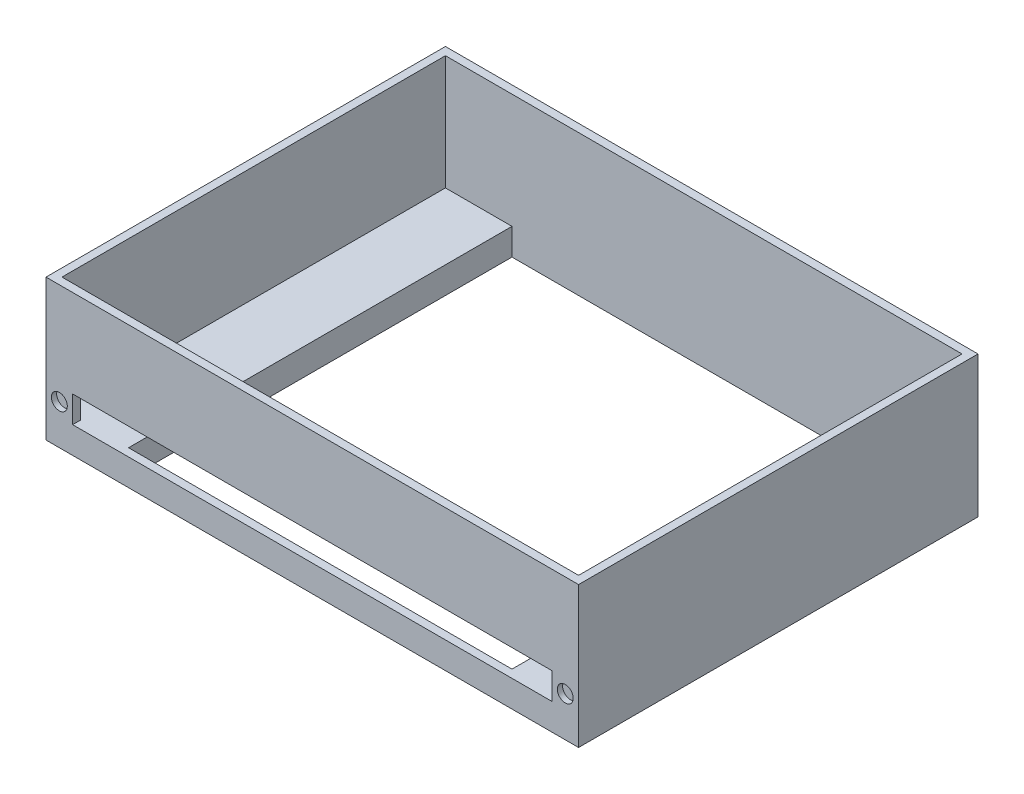
ISO-10303-21;
HEADER;
FILE_DESCRIPTION(('STEP AP214'),'2;1');
FILE_NAME('part.step','',(''),(''),'','','');
FILE_SCHEMA(('AUTOMOTIVE_DESIGN { 1 0 10303 214 1 1 1 1 }'));
ENDSEC;
DATA;
#1=APPLICATION_CONTEXT('core data for automotive mechanical design processes');
#2=APPLICATION_PROTOCOL_DEFINITION('international standard','automotive_design',2000,#1);
#3=PRODUCT_CONTEXT('',#1,'mechanical');
#4=PRODUCT('Part','Part','',(#3));
#5=PRODUCT_RELATED_PRODUCT_CATEGORY('part','',(#4));
#6=PRODUCT_DEFINITION_FORMATION('','',#4);
#7=PRODUCT_DEFINITION_CONTEXT('part definition',#1,'design');
#8=PRODUCT_DEFINITION('design','',#6,#7);
#9=PRODUCT_DEFINITION_SHAPE('','',#8);
#10=(LENGTH_UNIT() NAMED_UNIT(*) SI_UNIT(.MILLI.,.METRE.));
#11=(NAMED_UNIT(*) PLANE_ANGLE_UNIT() SI_UNIT($,.RADIAN.));
#12=(NAMED_UNIT(*) SI_UNIT($,.STERADIAN.) SOLID_ANGLE_UNIT());
#13=UNCERTAINTY_MEASURE_WITH_UNIT(LENGTH_MEASURE(1.E-05),#10,'distance_accuracy_value','');
#14=(GEOMETRIC_REPRESENTATION_CONTEXT(3) GLOBAL_UNCERTAINTY_ASSIGNED_CONTEXT((#13)) GLOBAL_UNIT_ASSIGNED_CONTEXT((#10,
#11,#12)) REPRESENTATION_CONTEXT('',''));
#15=CARTESIAN_POINT('',(0.,0.,0.));
#16=DIRECTION('',(0.,0.,1.));
#17=DIRECTION('',(1.,0.,0.));
#18=AXIS2_PLACEMENT_3D('',#15,#16,#17);
#19=CARTESIAN_POINT('',(-97.,53.,72.));
#20=DIRECTION('',(0.,0.,-1.));
#21=DIRECTION('',(-1.,0.,0.));
#22=AXIS2_PLACEMENT_3D('',#19,#20,#21);
#23=PLANE('',#22);
#24=DIRECTION('',(0.,1.,0.));
#25=VECTOR('',#24,1.);
#26=CARTESIAN_POINT('',(-90.,53.,72.));
#27=LINE('',#26,#25);
#28=CARTESIAN_POINT('',(-90.,10.,72.));
#29=VERTEX_POINT('',#28);
#30=CARTESIAN_POINT('',(-90.,20.,72.));
#31=VERTEX_POINT('',#30);
#32=EDGE_CURVE('E254',#29,#31,#27,.T.);
#33=ORIENTED_EDGE('',*,*,#32,.F.);
#34=DIRECTION('',(-1.,0.,0.));
#35=VECTOR('',#34,1.);
#36=CARTESIAN_POINT('',(-72.,10.,72.));
#37=LINE('',#36,#35);
#38=CARTESIAN_POINT('',(-97.,10.,72.));
#39=VERTEX_POINT('',#38);
#40=EDGE_CURVE('E202',#29,#39,#37,.T.);
#41=ORIENTED_EDGE('',*,*,#40,.T.);
#42=DIRECTION('',(0.,-1.,0.));
#43=VECTOR('',#42,1.);
#44=CARTESIAN_POINT('',(-97.,53.,72.));
#45=LINE('',#44,#43);
#46=CARTESIAN_POINT('',(-97.,53.,72.));
#47=VERTEX_POINT('',#46);
#48=EDGE_CURVE('E278',#47,#39,#45,.T.);
#49=ORIENTED_EDGE('',*,*,#48,.F.);
#50=DIRECTION('',(1.,0.,0.));
#51=VECTOR('',#50,1.);
#52=CARTESIAN_POINT('',(-97.,53.,72.));
#53=LINE('',#52,#51);
#54=CARTESIAN_POINT('',(97.,53.,72.));
#55=VERTEX_POINT('',#54);
#56=EDGE_CURVE('E265',#47,#55,#53,.T.);
#57=ORIENTED_EDGE('',*,*,#56,.T.);
#58=DIRECTION('',(0.,-1.,0.));
#59=VECTOR('',#58,1.);
#60=CARTESIAN_POINT('',(97.,53.,72.));
#61=LINE('',#60,#59);
#62=CARTESIAN_POINT('',(97.,10.,72.));
#63=VERTEX_POINT('',#62);
#64=EDGE_CURVE('E289',#55,#63,#61,.T.);
#65=ORIENTED_EDGE('',*,*,#64,.T.);
#66=DIRECTION('',(1.,0.,0.));
#67=VECTOR('',#66,1.);
#68=CARTESIAN_POINT('',(72.,10.,72.));
#69=LINE('',#68,#67);
#70=CARTESIAN_POINT('',(90.,10.,72.));
#71=VERTEX_POINT('',#70);
#72=EDGE_CURVE('E220',#71,#63,#69,.T.);
#73=ORIENTED_EDGE('',*,*,#72,.F.);
#74=DIRECTION('',(0.,-1.,0.));
#75=VECTOR('',#74,1.);
#76=CARTESIAN_POINT('',(90.,52.9999999999998,72.));
#77=LINE('',#76,#75);
#78=CARTESIAN_POINT('',(90.,20.,72.));
#79=VERTEX_POINT('',#78);
#80=EDGE_CURVE('E261',#79,#71,#77,.T.);
#81=ORIENTED_EDGE('',*,*,#80,.F.);
#82=DIRECTION('',(1.,0.,0.));
#83=VECTOR('',#82,1.);
#84=CARTESIAN_POINT('',(-97.,20.,72.));
#85=LINE('',#84,#83);
#86=EDGE_CURVE('E242',#31,#79,#85,.T.);
#87=ORIENTED_EDGE('',*,*,#86,.F.);
#88=EDGE_LOOP('',(#33,#41,#49,#57,#65,#73,#81,#87));
#89=FACE_BOUND('',#88,.T.);
#90=ADVANCED_FACE('F38',(#89),#23,.T.);
#91=DIRECTION('',(0.,1.,0.));
#92=VECTOR('',#91,1.);
#93=CARTESIAN_POINT('',(72.,10.,72.));
#94=LINE('',#93,#92);
#95=CARTESIAN_POINT('',(72.,0.,72.));
#96=VERTEX_POINT('',#95);
#97=CARTESIAN_POINT('',(72.0000000000001,9.99999999999998,72.));
#98=VERTEX_POINT('',#97);
#99=EDGE_CURVE('E162',#96,#98,#94,.T.);
#100=ORIENTED_EDGE('',*,*,#99,.F.);
#101=DIRECTION('',(1.,0.,0.));
#102=VECTOR('',#101,1.);
#103=CARTESIAN_POINT('',(-72.,0.,72.));
#104=LINE('',#103,#102);
#105=CARTESIAN_POINT('',(-72.,0.,72.));
#106=VERTEX_POINT('',#105);
#107=EDGE_CURVE('E177',#106,#96,#104,.T.);
#108=ORIENTED_EDGE('',*,*,#107,.F.);
#109=DIRECTION('',(0.,-1.,0.));
#110=VECTOR('',#109,1.);
#111=CARTESIAN_POINT('',(-72.,3.,72.));
#112=LINE('',#111,#110);
#113=CARTESIAN_POINT('',(-72.,10.,72.));
#114=VERTEX_POINT('',#113);
#115=EDGE_CURVE('E199',#114,#106,#112,.T.);
#116=ORIENTED_EDGE('',*,*,#115,.F.);
#117=DIRECTION('',(-1.,0.,0.));
#118=VECTOR('',#117,1.);
#119=CARTESIAN_POINT('',(-97.,10.,72.));
#120=LINE('',#119,#118);
#121=EDGE_CURVE('E258',#98,#114,#120,.T.);
#122=ORIENTED_EDGE('',*,*,#121,.F.);
#123=EDGE_LOOP('',(#100,#108,#116,#122));
#124=FACE_BOUND('',#123,.T.);
#125=ADVANCED_FACE('F356',(#124),#23,.T.);
#126=CARTESIAN_POINT('',(97.,53.,-72.));
#127=DIRECTION('',(0.,0.,1.));
#128=DIRECTION('',(1.,0.,0.));
#129=AXIS2_PLACEMENT_3D('',#126,#127,#128);
#130=PLANE('',#129);
#131=DIRECTION('',(0.,-1.,0.));
#132=VECTOR('',#131,1.);
#133=CARTESIAN_POINT('',(-97.,53.,-72.));
#134=LINE('',#133,#132);
#135=CARTESIAN_POINT('',(-97.,53.,-72.));
#136=VERTEX_POINT('',#135);
#137=CARTESIAN_POINT('',(-97.,10.,-72.));
#138=VERTEX_POINT('',#137);
#139=EDGE_CURVE('E282',#136,#138,#134,.T.);
#140=ORIENTED_EDGE('',*,*,#139,.T.);
#141=DIRECTION('',(-1.,0.,0.));
#142=VECTOR('',#141,1.);
#143=CARTESIAN_POINT('',(-72.,10.,-72.));
#144=LINE('',#143,#142);
#145=CARTESIAN_POINT('',(-72.,10.,-72.));
#146=VERTEX_POINT('',#145);
#147=EDGE_CURVE('E208',#146,#138,#144,.T.);
#148=ORIENTED_EDGE('',*,*,#147,.F.);
#149=DIRECTION('',(0.,1.,0.));
#150=VECTOR('',#149,1.);
#151=CARTESIAN_POINT('',(-72.,3.,-72.));
#152=LINE('',#151,#150);
#153=CARTESIAN_POINT('',(-72.,0.,-72.));
#154=VERTEX_POINT('',#153);
#155=EDGE_CURVE('E54',#154,#146,#152,.T.);
#156=ORIENTED_EDGE('',*,*,#155,.F.);
#157=DIRECTION('',(-1.,0.,0.));
#158=VECTOR('',#157,1.);
#159=CARTESIAN_POINT('',(72.,0.,-72.));
#160=LINE('',#159,#158);
#161=CARTESIAN_POINT('',(72.,0.,-72.));
#162=VERTEX_POINT('',#161);
#163=EDGE_CURVE('E166',#162,#154,#160,.T.);
#164=ORIENTED_EDGE('',*,*,#163,.F.);
#165=DIRECTION('',(0.,-1.,0.));
#166=VECTOR('',#165,1.);
#167=CARTESIAN_POINT('',(72.,10.,-72.));
#168=LINE('',#167,#166);
#169=CARTESIAN_POINT('',(72.,10.,-72.));
#170=VERTEX_POINT('',#169);
#171=EDGE_CURVE('E155',#170,#162,#168,.T.);
#172=ORIENTED_EDGE('',*,*,#171,.F.);
#173=DIRECTION('',(1.,0.,0.));
#174=VECTOR('',#173,1.);
#175=CARTESIAN_POINT('',(72.,10.,-72.));
#176=LINE('',#175,#174);
#177=CARTESIAN_POINT('',(97.,10.,-72.));
#178=VERTEX_POINT('',#177);
#179=EDGE_CURVE('E215',#170,#178,#176,.T.);
#180=ORIENTED_EDGE('',*,*,#179,.T.);
#181=DIRECTION('',(0.,-1.,0.));
#182=VECTOR('',#181,1.);
#183=CARTESIAN_POINT('',(97.,53.,-72.));
#184=LINE('',#183,#182);
#185=CARTESIAN_POINT('',(97.,53.,-72.));
#186=VERTEX_POINT('',#185);
#187=EDGE_CURVE('E285',#186,#178,#184,.T.);
#188=ORIENTED_EDGE('',*,*,#187,.F.);
#189=DIRECTION('',(-1.,0.,0.));
#190=VECTOR('',#189,1.);
#191=CARTESIAN_POINT('',(97.,53.,-72.));
#192=LINE('',#191,#190);
#193=EDGE_CURVE('E271',#186,#136,#192,.T.);
#194=ORIENTED_EDGE('',*,*,#193,.T.);
#195=EDGE_LOOP('',(#140,#148,#156,#164,#172,#180,#188,#194));
#196=FACE_BOUND('',#195,.T.);
#197=ADVANCED_FACE('F168',(#196),#130,.T.);
#198=CARTESIAN_POINT('',(-97.,53.,-72.));
#199=DIRECTION('',(1.,0.,0.));
#200=DIRECTION('',(0.,0.,-1.));
#201=AXIS2_PLACEMENT_3D('',#198,#199,#200);
#202=PLANE('',#201);
#203=ORIENTED_EDGE('',*,*,#48,.T.);
#204=DIRECTION('',(0.,0.,1.));
#205=VECTOR('',#204,1.);
#206=CARTESIAN_POINT('',(-97.,10.,72.));
#207=LINE('',#206,#205);
#208=EDGE_CURVE('E193',#138,#39,#207,.T.);
#209=ORIENTED_EDGE('',*,*,#208,.F.);
#210=ORIENTED_EDGE('',*,*,#139,.F.);
#211=DIRECTION('',(0.,0.,1.));
#212=VECTOR('',#211,1.);
#213=CARTESIAN_POINT('',(-97.,53.,-72.));
#214=LINE('',#213,#212);
#215=EDGE_CURVE('E275',#136,#47,#214,.T.);
#216=ORIENTED_EDGE('',*,*,#215,.T.);
#217=EDGE_LOOP('',(#203,#209,#210,#216));
#218=FACE_BOUND('',#217,.T.);
#219=ADVANCED_FACE('F406',(#218),#202,.T.);
#220=CARTESIAN_POINT('',(97.,53.,72.));
#221=DIRECTION('',(-1.,0.,0.));
#222=DIRECTION('',(0.,0.,1.));
#223=AXIS2_PLACEMENT_3D('',#220,#221,#222);
#224=PLANE('',#223);
#225=ORIENTED_EDGE('',*,*,#187,.T.);
#226=DIRECTION('',(0.,0.,-1.));
#227=VECTOR('',#226,1.);
#228=CARTESIAN_POINT('',(97.,10.,72.));
#229=LINE('',#228,#227);
#230=EDGE_CURVE('E163',#63,#178,#229,.T.);
#231=ORIENTED_EDGE('',*,*,#230,.F.);
#232=ORIENTED_EDGE('',*,*,#64,.F.);
#233=DIRECTION('',(0.,0.,-1.));
#234=VECTOR('',#233,1.);
#235=CARTESIAN_POINT('',(97.,53.,72.));
#236=LINE('',#235,#234);
#237=EDGE_CURVE('E268',#55,#186,#236,.T.);
#238=ORIENTED_EDGE('',*,*,#237,.T.);
#239=EDGE_LOOP('',(#225,#231,#232,#238));
#240=FACE_BOUND('',#239,.T.);
#241=ADVANCED_FACE('F354',(#240),#224,.T.);
#242=CARTESIAN_POINT('',(100.,3.,-75.));
#243=DIRECTION('',(-1.,0.,0.));
#244=DIRECTION('',(0.,0.,1.));
#245=AXIS2_PLACEMENT_3D('',#242,#243,#244);
#246=PLANE('',#245);
#247=DIRECTION('',(0.,0.,-1.));
#248=VECTOR('',#247,1.);
#249=CARTESIAN_POINT('',(100.,0.,-75.));
#250=LINE('',#249,#248);
#251=CARTESIAN_POINT('',(100.,0.,75.));
#252=VERTEX_POINT('',#251);
#253=CARTESIAN_POINT('',(100.,0.,-75.));
#254=VERTEX_POINT('',#253);
#255=EDGE_CURVE('E309',#252,#254,#250,.T.);
#256=ORIENTED_EDGE('',*,*,#255,.T.);
#257=DIRECTION('',(0.,-1.,0.));
#258=VECTOR('',#257,1.);
#259=CARTESIAN_POINT('',(100.,3.,-75.));
#260=LINE('',#259,#258);
#261=CARTESIAN_POINT('',(100.,53.,-75.));
#262=VERTEX_POINT('',#261);
#263=EDGE_CURVE('E11',#262,#254,#260,.T.);
#264=ORIENTED_EDGE('',*,*,#263,.F.);
#265=DIRECTION('',(0.,0.,-1.));
#266=VECTOR('',#265,1.);
#267=CARTESIAN_POINT('',(100.,53.,75.));
#268=LINE('',#267,#266);
#269=CARTESIAN_POINT('',(100.,53.,75.));
#270=VERTEX_POINT('',#269);
#271=EDGE_CURVE('E297',#270,#262,#268,.T.);
#272=ORIENTED_EDGE('',*,*,#271,.F.);
#273=DIRECTION('',(0.,-1.,0.));
#274=VECTOR('',#273,1.);
#275=CARTESIAN_POINT('',(100.,3.,75.));
#276=LINE('',#275,#274);
#277=EDGE_CURVE('E322',#270,#252,#276,.T.);
#278=ORIENTED_EDGE('',*,*,#277,.T.);
#279=EDGE_LOOP('',(#256,#264,#272,#278));
#280=FACE_BOUND('',#279,.T.);
#281=ADVANCED_FACE('F40',(#280),#246,.F.);
#282=CARTESIAN_POINT('',(-100.,3.,-75.));
#283=DIRECTION('',(0.,0.,1.));
#284=DIRECTION('',(1.,0.,0.));
#285=AXIS2_PLACEMENT_3D('',#282,#283,#284);
#286=PLANE('',#285);
#287=DIRECTION('',(-1.,0.,0.));
#288=VECTOR('',#287,1.);
#289=CARTESIAN_POINT('',(-100.,0.,-75.));
#290=LINE('',#289,#288);
#291=CARTESIAN_POINT('',(-100.,0.,-75.));
#292=VERTEX_POINT('',#291);
#293=EDGE_CURVE('E313',#254,#292,#290,.T.);
#294=ORIENTED_EDGE('',*,*,#293,.T.);
#295=DIRECTION('',(0.,-1.,0.));
#296=VECTOR('',#295,1.);
#297=CARTESIAN_POINT('',(-100.,3.,-75.));
#298=LINE('',#297,#296);
#299=CARTESIAN_POINT('',(-100.,53.,-75.));
#300=VERTEX_POINT('',#299);
#301=EDGE_CURVE('E47',#300,#292,#298,.T.);
#302=ORIENTED_EDGE('',*,*,#301,.F.);
#303=DIRECTION('',(-1.,0.,0.));
#304=VECTOR('',#303,1.);
#305=CARTESIAN_POINT('',(100.,53.,-75.));
#306=LINE('',#305,#304);
#307=EDGE_CURVE('E301',#262,#300,#306,.T.);
#308=ORIENTED_EDGE('',*,*,#307,.F.);
#309=ORIENTED_EDGE('',*,*,#263,.T.);
#310=EDGE_LOOP('',(#294,#302,#308,#309));
#311=FACE_BOUND('',#310,.T.);
#312=ADVANCED_FACE('F347',(#311),#286,.F.);
#313=CARTESIAN_POINT('',(-100.,3.,-75.));
#314=DIRECTION('',(1.,0.,0.));
#315=DIRECTION('',(0.,0.,-1.));
#316=AXIS2_PLACEMENT_3D('',#313,#314,#315);
#317=PLANE('',#316);
#318=DIRECTION('',(0.,0.,1.));
#319=VECTOR('',#318,1.);
#320=CARTESIAN_POINT('',(-100.,0.,-75.));
#321=LINE('',#320,#319);
#322=CARTESIAN_POINT('',(-100.,0.,75.));
#323=VERTEX_POINT('',#322);
#324=EDGE_CURVE('E316',#292,#323,#321,.T.);
#325=ORIENTED_EDGE('',*,*,#324,.T.);
#326=DIRECTION('',(0.,-1.,0.));
#327=VECTOR('',#326,1.);
#328=CARTESIAN_POINT('',(-100.,3.,75.));
#329=LINE('',#328,#327);
#330=CARTESIAN_POINT('',(-100.,53.,75.));
#331=VERTEX_POINT('',#330);
#332=EDGE_CURVE('E326',#331,#323,#329,.T.);
#333=ORIENTED_EDGE('',*,*,#332,.F.);
#334=DIRECTION('',(0.,0.,1.));
#335=VECTOR('',#334,1.);
#336=CARTESIAN_POINT('',(-100.,53.,-75.));
#337=LINE('',#336,#335);
#338=EDGE_CURVE('E305',#300,#331,#337,.T.);
#339=ORIENTED_EDGE('',*,*,#338,.F.);
#340=ORIENTED_EDGE('',*,*,#301,.T.);
#341=EDGE_LOOP('',(#325,#333,#339,#340));
#342=FACE_BOUND('',#341,.T.);
#343=ADVANCED_FACE('F334',(#342),#317,.F.);
#344=CARTESIAN_POINT('',(-100.,3.,75.));
#345=DIRECTION('',(0.,0.,-1.));
#346=DIRECTION('',(-1.,0.,0.));
#347=AXIS2_PLACEMENT_3D('',#344,#345,#346);
#348=PLANE('',#347);
#349=CARTESIAN_POINT('',(-95.,15.,75.));
#350=DIRECTION('',(0.,0.,1.));
#351=DIRECTION('',(1.,0.,0.));
#352=AXIS2_PLACEMENT_3D('',#349,#350,#351);
#353=CIRCLE('',#352,3.00000000000001);
#354=CARTESIAN_POINT('',(-92.,15.,75.));
#355=VERTEX_POINT('',#354);
#356=EDGE_CURVE('E183',#355,#355,#353,.T.);
#357=ORIENTED_EDGE('',*,*,#356,.F.);
#358=EDGE_LOOP('',(#357));
#359=FACE_BOUND('',#358,.T.);
#360=CARTESIAN_POINT('',(95.,15.,75.));
#361=DIRECTION('',(0.,0.,1.));
#362=DIRECTION('',(1.,0.,0.));
#363=AXIS2_PLACEMENT_3D('',#360,#361,#362);
#364=CIRCLE('',#363,3.00000000000001);
#365=CARTESIAN_POINT('',(98.,15.,75.));
#366=VERTEX_POINT('',#365);
#367=EDGE_CURVE('E186',#366,#366,#364,.T.);
#368=ORIENTED_EDGE('',*,*,#367,.F.);
#369=EDGE_LOOP('',(#368));
#370=FACE_BOUND('',#369,.T.);
#371=DIRECTION('',(-1.,0.,0.));
#372=VECTOR('',#371,1.);
#373=CARTESIAN_POINT('',(-90.,20.,75.));
#374=LINE('',#373,#372);
#375=CARTESIAN_POINT('',(90.,20.,75.));
#376=VERTEX_POINT('',#375);
#377=CARTESIAN_POINT('',(-90.,20.,75.));
#378=VERTEX_POINT('',#377);
#379=EDGE_CURVE('E226',#376,#378,#374,.T.);
#380=ORIENTED_EDGE('',*,*,#379,.F.);
#381=DIRECTION('',(0.,1.,0.));
#382=VECTOR('',#381,1.);
#383=CARTESIAN_POINT('',(90.,20.,75.));
#384=LINE('',#383,#382);
#385=CARTESIAN_POINT('',(90.,9.99999999999998,75.));
#386=VERTEX_POINT('',#385);
#387=EDGE_CURVE('E223',#386,#376,#384,.T.);
#388=ORIENTED_EDGE('',*,*,#387,.F.);
#389=DIRECTION('',(1.,0.,0.));
#390=VECTOR('',#389,1.);
#391=CARTESIAN_POINT('',(-90.,10.,75.));
#392=LINE('',#391,#390);
#393=CARTESIAN_POINT('',(-90.,10.,75.));
#394=VERTEX_POINT('',#393);
#395=EDGE_CURVE('E234',#394,#386,#392,.T.);
#396=ORIENTED_EDGE('',*,*,#395,.F.);
#397=DIRECTION('',(0.,-1.,0.));
#398=VECTOR('',#397,1.);
#399=CARTESIAN_POINT('',(-90.,20.,75.));
#400=LINE('',#399,#398);
#401=EDGE_CURVE('E230',#378,#394,#400,.T.);
#402=ORIENTED_EDGE('',*,*,#401,.F.);
#403=EDGE_LOOP('',(#380,#388,#396,#402));
#404=FACE_BOUND('',#403,.T.);
#405=DIRECTION('',(1.,0.,0.));
#406=VECTOR('',#405,1.);
#407=CARTESIAN_POINT('',(-100.,0.,75.));
#408=LINE('',#407,#406);
#409=EDGE_CURVE('E319',#323,#252,#408,.T.);
#410=ORIENTED_EDGE('',*,*,#409,.T.);
#411=ORIENTED_EDGE('',*,*,#277,.F.);
#412=DIRECTION('',(1.,0.,0.));
#413=VECTOR('',#412,1.);
#414=CARTESIAN_POINT('',(-100.,53.,75.));
#415=LINE('',#414,#413);
#416=EDGE_CURVE('E293',#331,#270,#415,.T.);
#417=ORIENTED_EDGE('',*,*,#416,.F.);
#418=ORIENTED_EDGE('',*,*,#332,.T.);
#419=EDGE_LOOP('',(#410,#411,#417,#418));
#420=FACE_BOUND('',#419,.T.);
#421=ADVANCED_FACE('F340',(#359,#370,#404,#420),#348,.F.);
#422=CARTESIAN_POINT('',(0.,0.,0.));
#423=DIRECTION('',(0.,1.,0.));
#424=DIRECTION('',(0.,0.,1.));
#425=AXIS2_PLACEMENT_3D('',#422,#423,#424);
#426=PLANE('',#425);
#427=CARTESIAN_POINT('',(-95.,0.,-70.));
#428=DIRECTION('',(0.,-1.,0.));
#429=DIRECTION('',(0.,0.,-1.));
#430=AXIS2_PLACEMENT_3D('',#427,#428,#429);
#431=CIRCLE('',#430,1.5);
#432=CARTESIAN_POINT('',(-95.,0.,-71.5));
#433=VERTEX_POINT('',#432);
#434=EDGE_CURVE('E663',#433,#433,#431,.T.);
#435=ORIENTED_EDGE('',*,*,#434,.F.);
#436=EDGE_LOOP('',(#435));
#437=FACE_BOUND('',#436,.T.);
#438=CARTESIAN_POINT('',(95.,0.,-70.));
#439=DIRECTION('',(0.,-1.,0.));
#440=DIRECTION('',(0.,0.,-1.));
#441=AXIS2_PLACEMENT_3D('',#438,#439,#440);
#442=CIRCLE('',#441,1.5);
#443=CARTESIAN_POINT('',(95.,0.,-71.5));
#444=VERTEX_POINT('',#443);
#445=EDGE_CURVE('E662',#444,#444,#442,.T.);
#446=ORIENTED_EDGE('',*,*,#445,.F.);
#447=EDGE_LOOP('',(#446));
#448=FACE_BOUND('',#447,.T.);
#449=CARTESIAN_POINT('',(95.,0.,70.));
#450=DIRECTION('',(0.,-1.,0.));
#451=DIRECTION('',(0.,0.,-1.));
#452=AXIS2_PLACEMENT_3D('',#449,#450,#451);
#453=CIRCLE('',#452,1.5);
#454=CARTESIAN_POINT('',(95.,0.,68.5));
#455=VERTEX_POINT('',#454);
#456=EDGE_CURVE('E693',#455,#455,#453,.T.);
#457=ORIENTED_EDGE('',*,*,#456,.F.);
#458=EDGE_LOOP('',(#457));
#459=FACE_BOUND('',#458,.T.);
#460=CARTESIAN_POINT('',(-95.,0.,70.));
#461=DIRECTION('',(0.,-1.,0.));
#462=DIRECTION('',(0.,0.,-1.));
#463=AXIS2_PLACEMENT_3D('',#460,#461,#462);
#464=CIRCLE('',#463,1.5);
#465=CARTESIAN_POINT('',(-95.,0.,68.5));
#466=VERTEX_POINT('',#465);
#467=EDGE_CURVE('E678',#466,#466,#464,.T.);
#468=ORIENTED_EDGE('',*,*,#467,.F.);
#469=EDGE_LOOP('',(#468));
#470=FACE_BOUND('',#469,.T.);
#471=ORIENTED_EDGE('',*,*,#107,.T.);
#472=DIRECTION('',(0.,0.,-1.));
#473=VECTOR('',#472,1.);
#474=CARTESIAN_POINT('',(72.,0.,72.));
#475=LINE('',#474,#473);
#476=EDGE_CURVE('E158',#96,#162,#475,.T.);
#477=ORIENTED_EDGE('',*,*,#476,.T.);
#478=ORIENTED_EDGE('',*,*,#163,.T.);
#479=DIRECTION('',(0.,0.,1.));
#480=VECTOR('',#479,1.);
#481=CARTESIAN_POINT('',(-72.,0.,-72.));
#482=LINE('',#481,#480);
#483=EDGE_CURVE('E172',#154,#106,#482,.T.);
#484=ORIENTED_EDGE('',*,*,#483,.T.);
#485=EDGE_LOOP('',(#471,#477,#478,#484));
#486=FACE_BOUND('',#485,.T.);
#487=ORIENTED_EDGE('',*,*,#255,.F.);
#488=ORIENTED_EDGE('',*,*,#409,.F.);
#489=ORIENTED_EDGE('',*,*,#324,.F.);
#490=ORIENTED_EDGE('',*,*,#293,.F.);
#491=EDGE_LOOP('',(#487,#488,#489,#490));
#492=FACE_BOUND('',#491,.T.);
#493=ADVANCED_FACE('F174',(#437,#448,#459,#470,#486,#492),#426,.F.);
#494=CARTESIAN_POINT('',(0.,53.,0.));
#495=DIRECTION('',(0.,1.,0.));
#496=DIRECTION('',(0.,0.,1.));
#497=AXIS2_PLACEMENT_3D('',#494,#495,#496);
#498=PLANE('',#497);
#499=ORIENTED_EDGE('',*,*,#416,.T.);
#500=ORIENTED_EDGE('',*,*,#271,.T.);
#501=ORIENTED_EDGE('',*,*,#307,.T.);
#502=ORIENTED_EDGE('',*,*,#338,.T.);
#503=EDGE_LOOP('',(#499,#500,#501,#502));
#504=FACE_BOUND('',#503,.T.);
#505=ORIENTED_EDGE('',*,*,#237,.F.);
#506=ORIENTED_EDGE('',*,*,#56,.F.);
#507=ORIENTED_EDGE('',*,*,#215,.F.);
#508=ORIENTED_EDGE('',*,*,#193,.F.);
#509=EDGE_LOOP('',(#505,#506,#507,#508));
#510=FACE_BOUND('',#509,.T.);
#511=ADVANCED_FACE('F345',(#504,#510),#498,.T.);
#512=CARTESIAN_POINT('',(90.,20.,-252.277563773199));
#513=DIRECTION('',(1.,0.,0.));
#514=DIRECTION('',(0.,1.,0.));
#515=AXIS2_PLACEMENT_3D('',#512,#513,#514);
#516=PLANE('',#515);
#517=ORIENTED_EDGE('',*,*,#80,.T.);
#518=DIRECTION('',(0.,0.,1.));
#519=VECTOR('',#518,1.);
#520=CARTESIAN_POINT('',(90.,9.99999999999998,-252.277563773199));
#521=LINE('',#520,#519);
#522=EDGE_CURVE('E239',#71,#386,#521,.T.);
#523=ORIENTED_EDGE('',*,*,#522,.T.);
#524=ORIENTED_EDGE('',*,*,#387,.T.);
#525=DIRECTION('',(0.,0.,1.));
#526=VECTOR('',#525,1.);
#527=CARTESIAN_POINT('',(90.,20.,-252.277563773199));
#528=LINE('',#527,#526);
#529=EDGE_CURVE('E238',#79,#376,#528,.T.);
#530=ORIENTED_EDGE('',*,*,#529,.F.);
#531=EDGE_LOOP('',(#517,#523,#524,#530));
#532=FACE_BOUND('',#531,.T.);
#533=ADVANCED_FACE('F369',(#532),#516,.F.);
#534=CARTESIAN_POINT('',(-90.,10.,-252.277563773199));
#535=DIRECTION('',(0.,-1.,0.));
#536=DIRECTION('',(1.,0.,0.));
#537=AXIS2_PLACEMENT_3D('',#534,#535,#536);
#538=PLANE('',#537);
#539=ORIENTED_EDGE('',*,*,#522,.F.);
#540=ORIENTED_EDGE('',*,*,#72,.T.);
#541=ORIENTED_EDGE('',*,*,#230,.T.);
#542=ORIENTED_EDGE('',*,*,#179,.F.);
#543=DIRECTION('',(0.,0.,-1.));
#544=VECTOR('',#543,1.);
#545=CARTESIAN_POINT('',(72.,10.,72.));
#546=LINE('',#545,#544);
#547=EDGE_CURVE('E62',#98,#170,#546,.T.);
#548=ORIENTED_EDGE('',*,*,#547,.F.);
#549=ORIENTED_EDGE('',*,*,#121,.T.);
#550=DIRECTION('',(0.,0.,1.));
#551=VECTOR('',#550,1.);
#552=CARTESIAN_POINT('',(-72.,10.,72.));
#553=LINE('',#552,#551);
#554=EDGE_CURVE('E196',#146,#114,#553,.T.);
#555=ORIENTED_EDGE('',*,*,#554,.F.);
#556=ORIENTED_EDGE('',*,*,#147,.T.);
#557=ORIENTED_EDGE('',*,*,#208,.T.);
#558=ORIENTED_EDGE('',*,*,#40,.F.);
#559=DIRECTION('',(0.,0.,1.));
#560=VECTOR('',#559,1.);
#561=CARTESIAN_POINT('',(-90.,10.,-252.277563773199));
#562=LINE('',#561,#560);
#563=EDGE_CURVE('E243',#29,#394,#562,.T.);
#564=ORIENTED_EDGE('',*,*,#563,.T.);
#565=ORIENTED_EDGE('',*,*,#395,.T.);
#566=EDGE_LOOP('',(#539,#540,#541,#542,#548,#549,#555,#556,#557,#558,#564,#565));
#567=FACE_BOUND('',#566,.T.);
#568=ADVANCED_FACE('F397',(#567),#538,.F.);
#569=CARTESIAN_POINT('',(-90.,20.,-252.277563773199));
#570=DIRECTION('',(-1.,0.,0.));
#571=DIRECTION('',(0.,0.,1.));
#572=AXIS2_PLACEMENT_3D('',#569,#570,#571);
#573=PLANE('',#572);
#574=ORIENTED_EDGE('',*,*,#32,.T.);
#575=DIRECTION('',(0.,0.,1.));
#576=VECTOR('',#575,1.);
#577=CARTESIAN_POINT('',(-90.,20.,-252.277563773199));
#578=LINE('',#577,#576);
#579=EDGE_CURVE('E246',#31,#378,#578,.T.);
#580=ORIENTED_EDGE('',*,*,#579,.T.);
#581=ORIENTED_EDGE('',*,*,#401,.T.);
#582=ORIENTED_EDGE('',*,*,#563,.F.);
#583=EDGE_LOOP('',(#574,#580,#581,#582));
#584=FACE_BOUND('',#583,.T.);
#585=ADVANCED_FACE('F410',(#584),#573,.F.);
#586=CARTESIAN_POINT('',(-90.,20.,-252.277563773199));
#587=DIRECTION('',(0.,1.,0.));
#588=DIRECTION('',(-1.,0.,0.));
#589=AXIS2_PLACEMENT_3D('',#586,#587,#588);
#590=PLANE('',#589);
#591=ORIENTED_EDGE('',*,*,#86,.T.);
#592=ORIENTED_EDGE('',*,*,#529,.T.);
#593=ORIENTED_EDGE('',*,*,#379,.T.);
#594=ORIENTED_EDGE('',*,*,#579,.F.);
#595=EDGE_LOOP('',(#591,#592,#593,#594));
#596=FACE_BOUND('',#595,.T.);
#597=ADVANCED_FACE('F389',(#596),#590,.F.);
#598=CARTESIAN_POINT('',(72.,0.,0.));
#599=DIRECTION('',(1.,0.,0.));
#600=DIRECTION('',(0.,0.,-1.));
#601=AXIS2_PLACEMENT_3D('',#598,#599,#600);
#602=PLANE('',#601);
#603=ORIENTED_EDGE('',*,*,#171,.T.);
#604=ORIENTED_EDGE('',*,*,#476,.F.);
#605=ORIENTED_EDGE('',*,*,#99,.T.);
#606=ORIENTED_EDGE('',*,*,#547,.T.);
#607=EDGE_LOOP('',(#603,#604,#605,#606));
#608=FACE_BOUND('',#607,.T.);
#609=ADVANCED_FACE('F156',(#608),#602,.F.);
#610=CARTESIAN_POINT('',(-72.,0.,0.));
#611=DIRECTION('',(-1.,0.,0.));
#612=DIRECTION('',(0.,0.,1.));
#613=AXIS2_PLACEMENT_3D('',#610,#611,#612);
#614=PLANE('',#613);
#615=ORIENTED_EDGE('',*,*,#155,.T.);
#616=ORIENTED_EDGE('',*,*,#554,.T.);
#617=ORIENTED_EDGE('',*,*,#115,.T.);
#618=ORIENTED_EDGE('',*,*,#483,.F.);
#619=EDGE_LOOP('',(#615,#616,#617,#618));
#620=FACE_BOUND('',#619,.T.);
#621=ADVANCED_FACE('F481',(#620),#614,.F.);
#622=CARTESIAN_POINT('',(95.,15.,73.));
#623=DIRECTION('',(0.,0.,1.));
#624=DIRECTION('',(1.,0.,0.));
#625=AXIS2_PLACEMENT_3D('',#622,#623,#624);
#626=CYLINDRICAL_SURFACE('',#625,3.00000000000001);
#627=CARTESIAN_POINT('',(95.,15.,73.));
#628=DIRECTION('',(0.,0.,1.));
#629=DIRECTION('',(1.,0.,0.));
#630=AXIS2_PLACEMENT_3D('',#627,#628,#629);
#631=CIRCLE('',#630,3.00000000000001);
#632=CARTESIAN_POINT('',(98.,15.,73.));
#633=VERTEX_POINT('',#632);
#634=EDGE_CURVE('E684',#633,#633,#631,.T.);
#635=ORIENTED_EDGE('',*,*,#634,.F.);
#636=EDGE_LOOP('',(#635));
#637=FACE_BOUND('',#636,.T.);
#638=ORIENTED_EDGE('',*,*,#367,.T.);
#639=EDGE_LOOP('',(#638));
#640=FACE_BOUND('',#639,.T.);
#641=ADVANCED_FACE('F487',(#637,#640),#626,.F.);
#642=CARTESIAN_POINT('',(95.,15.,73.));
#643=DIRECTION('',(0.,0.,1.));
#644=DIRECTION('',(1.,0.,0.));
#645=AXIS2_PLACEMENT_3D('',#642,#643,#644);
#646=PLANE('',#645);
#647=ORIENTED_EDGE('',*,*,#634,.T.);
#648=EDGE_LOOP('',(#647));
#649=FACE_BOUND('',#648,.T.);
#650=ADVANCED_FACE('F495',(#649),#646,.T.);
#651=CARTESIAN_POINT('',(-95.,15.,73.));
#652=DIRECTION('',(0.,0.,1.));
#653=DIRECTION('',(1.,0.,0.));
#654=AXIS2_PLACEMENT_3D('',#651,#652,#653);
#655=CYLINDRICAL_SURFACE('',#654,3.00000000000001);
#656=CARTESIAN_POINT('',(-95.,15.,73.));
#657=DIRECTION('',(0.,0.,1.));
#658=DIRECTION('',(1.,0.,0.));
#659=AXIS2_PLACEMENT_3D('',#656,#657,#658);
#660=CIRCLE('',#659,3.00000000000001);
#661=CARTESIAN_POINT('',(-92.,15.,73.));
#662=VERTEX_POINT('',#661);
#663=EDGE_CURVE('E179',#662,#662,#660,.T.);
#664=ORIENTED_EDGE('',*,*,#663,.F.);
#665=EDGE_LOOP('',(#664));
#666=FACE_BOUND('',#665,.T.);
#667=ORIENTED_EDGE('',*,*,#356,.T.);
#668=EDGE_LOOP('',(#667));
#669=FACE_BOUND('',#668,.T.);
#670=ADVANCED_FACE('F503',(#666,#669),#655,.F.);
#671=CARTESIAN_POINT('',(-95.,15.,73.));
#672=DIRECTION('',(0.,0.,1.));
#673=DIRECTION('',(1.,0.,0.));
#674=AXIS2_PLACEMENT_3D('',#671,#672,#673);
#675=PLANE('',#674);
#676=ORIENTED_EDGE('',*,*,#663,.T.);
#677=EDGE_LOOP('',(#676));
#678=FACE_BOUND('',#677,.T.);
#679=ADVANCED_FACE('F511',(#678),#675,.T.);
#680=CARTESIAN_POINT('',(-95.,8.,70.));
#681=DIRECTION('',(0.,-1.,0.));
#682=DIRECTION('',(0.,0.,-1.));
#683=AXIS2_PLACEMENT_3D('',#680,#681,#682);
#684=CYLINDRICAL_SURFACE('',#683,1.5);
#685=CARTESIAN_POINT('',(-95.,8.,70.));
#686=DIRECTION('',(0.,-1.,0.));
#687=DIRECTION('',(0.,0.,-1.));
#688=AXIS2_PLACEMENT_3D('',#685,#686,#687);
#689=CIRCLE('',#688,1.5);
#690=CARTESIAN_POINT('',(-95.,8.,68.5));
#691=VERTEX_POINT('',#690);
#692=EDGE_CURVE('E674',#691,#691,#689,.T.);
#693=ORIENTED_EDGE('',*,*,#692,.F.);
#694=EDGE_LOOP('',(#693));
#695=FACE_BOUND('',#694,.T.);
#696=ORIENTED_EDGE('',*,*,#467,.T.);
#697=EDGE_LOOP('',(#696));
#698=FACE_BOUND('',#697,.T.);
#699=ADVANCED_FACE('F519',(#695,#698),#684,.F.);
#700=CARTESIAN_POINT('',(-95.,8.,70.));
#701=DIRECTION('',(0.,-1.,0.));
#702=DIRECTION('',(0.,0.,-1.));
#703=AXIS2_PLACEMENT_3D('',#700,#701,#702);
#704=PLANE('',#703);
#705=ORIENTED_EDGE('',*,*,#692,.T.);
#706=EDGE_LOOP('',(#705));
#707=FACE_BOUND('',#706,.T.);
#708=ADVANCED_FACE('F527',(#707),#704,.T.);
#709=CARTESIAN_POINT('',(95.,8.,70.));
#710=DIRECTION('',(0.,-1.,0.));
#711=DIRECTION('',(0.,0.,-1.));
#712=AXIS2_PLACEMENT_3D('',#709,#710,#711);
#713=CYLINDRICAL_SURFACE('',#712,1.5);
#714=CARTESIAN_POINT('',(95.,8.,70.));
#715=DIRECTION('',(0.,-1.,0.));
#716=DIRECTION('',(0.,0.,-1.));
#717=AXIS2_PLACEMENT_3D('',#714,#715,#716);
#718=CIRCLE('',#717,1.5);
#719=CARTESIAN_POINT('',(95.,8.,68.5));
#720=VERTEX_POINT('',#719);
#721=EDGE_CURVE('E681',#720,#720,#718,.T.);
#722=ORIENTED_EDGE('',*,*,#721,.F.);
#723=EDGE_LOOP('',(#722));
#724=FACE_BOUND('',#723,.T.);
#725=ORIENTED_EDGE('',*,*,#456,.T.);
#726=EDGE_LOOP('',(#725));
#727=FACE_BOUND('',#726,.T.);
#728=ADVANCED_FACE('F535',(#724,#727),#713,.F.);
#729=CARTESIAN_POINT('',(95.,8.,70.));
#730=DIRECTION('',(0.,-1.,0.));
#731=DIRECTION('',(0.,0.,-1.));
#732=AXIS2_PLACEMENT_3D('',#729,#730,#731);
#733=PLANE('',#732);
#734=ORIENTED_EDGE('',*,*,#721,.T.);
#735=EDGE_LOOP('',(#734));
#736=FACE_BOUND('',#735,.T.);
#737=ADVANCED_FACE('F543',(#736),#733,.T.);
#738=CARTESIAN_POINT('',(95.,8.,-70.));
#739=DIRECTION('',(0.,-1.,0.));
#740=DIRECTION('',(0.,0.,-1.));
#741=AXIS2_PLACEMENT_3D('',#738,#739,#740);
#742=CYLINDRICAL_SURFACE('',#741,1.5);
#743=CARTESIAN_POINT('',(95.,8.,-70.));
#744=DIRECTION('',(0.,-1.,0.));
#745=DIRECTION('',(0.,0.,-1.));
#746=AXIS2_PLACEMENT_3D('',#743,#744,#745);
#747=CIRCLE('',#746,1.5);
#748=CARTESIAN_POINT('',(95.,8.,-71.5));
#749=VERTEX_POINT('',#748);
#750=EDGE_CURVE('E668',#749,#749,#747,.T.);
#751=ORIENTED_EDGE('',*,*,#750,.F.);
#752=EDGE_LOOP('',(#751));
#753=FACE_BOUND('',#752,.T.);
#754=ORIENTED_EDGE('',*,*,#445,.T.);
#755=EDGE_LOOP('',(#754));
#756=FACE_BOUND('',#755,.T.);
#757=ADVANCED_FACE('F551',(#753,#756),#742,.F.);
#758=CARTESIAN_POINT('',(95.,8.,-70.));
#759=DIRECTION('',(0.,-1.,0.));
#760=DIRECTION('',(0.,0.,-1.));
#761=AXIS2_PLACEMENT_3D('',#758,#759,#760);
#762=PLANE('',#761);
#763=ORIENTED_EDGE('',*,*,#750,.T.);
#764=EDGE_LOOP('',(#763));
#765=FACE_BOUND('',#764,.T.);
#766=ADVANCED_FACE('F559',(#765),#762,.T.);
#767=CARTESIAN_POINT('',(-95.,8.,-70.));
#768=DIRECTION('',(0.,-1.,0.));
#769=DIRECTION('',(0.,0.,-1.));
#770=AXIS2_PLACEMENT_3D('',#767,#768,#769);
#771=CYLINDRICAL_SURFACE('',#770,1.5);
#772=CARTESIAN_POINT('',(-95.,8.,-70.));
#773=DIRECTION('',(0.,-1.,0.));
#774=DIRECTION('',(0.,0.,-1.));
#775=AXIS2_PLACEMENT_3D('',#772,#773,#774);
#776=CIRCLE('',#775,1.5);
#777=CARTESIAN_POINT('',(-95.,8.,-71.5));
#778=VERTEX_POINT('',#777);
#779=EDGE_CURVE('E660',#778,#778,#776,.T.);
#780=ORIENTED_EDGE('',*,*,#779,.F.);
#781=EDGE_LOOP('',(#780));
#782=FACE_BOUND('',#781,.T.);
#783=ORIENTED_EDGE('',*,*,#434,.T.);
#784=EDGE_LOOP('',(#783));
#785=FACE_BOUND('',#784,.T.);
#786=ADVANCED_FACE('F567',(#782,#785),#771,.F.);
#787=CARTESIAN_POINT('',(-95.,8.,-70.));
#788=DIRECTION('',(0.,-1.,0.));
#789=DIRECTION('',(0.,0.,-1.));
#790=AXIS2_PLACEMENT_3D('',#787,#788,#789);
#791=PLANE('',#790);
#792=ORIENTED_EDGE('',*,*,#779,.T.);
#793=EDGE_LOOP('',(#792));
#794=FACE_BOUND('',#793,.T.);
#795=ADVANCED_FACE('F575',(#794),#791,.T.);
#796=CLOSED_SHELL('',(#90,#125,#197,#219,#241,#281,#312,#343,#421,#493,#511,#533,#568,#585,#597,
#609,#621,#641,#650,#670,#679,#699,#708,#728,#737,#757,#766,#786,#795));
#797=MANIFOLD_SOLID_BREP('B2',#796);
#798=ADVANCED_BREP_SHAPE_REPRESENTATION('',(#18,#797),#14);
#799=SHAPE_DEFINITION_REPRESENTATION(#9,#798);
ENDSEC;
END-ISO-10303-21;
